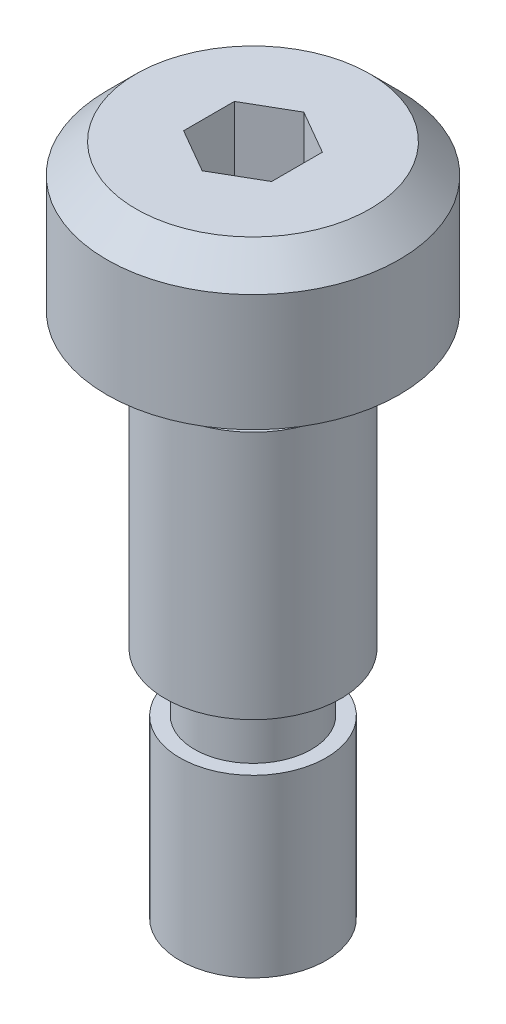
ISO-10303-21;
HEADER;
FILE_DESCRIPTION(('STEP AP214'),'2;1');
FILE_NAME('part.step','',(''),(''),'','','');
FILE_SCHEMA(('AUTOMOTIVE_DESIGN { 1 0 10303 214 1 1 1 1 }'));
ENDSEC;
DATA;
#1=APPLICATION_CONTEXT('core data for automotive mechanical design processes');
#2=APPLICATION_PROTOCOL_DEFINITION('international standard','automotive_design',2000,#1);
#3=PRODUCT_CONTEXT('',#1,'mechanical');
#4=PRODUCT('Part','Part','',(#3));
#5=PRODUCT_RELATED_PRODUCT_CATEGORY('part','',(#4));
#6=PRODUCT_DEFINITION_FORMATION('','',#4);
#7=PRODUCT_DEFINITION_CONTEXT('part definition',#1,'design');
#8=PRODUCT_DEFINITION('design','',#6,#7);
#9=PRODUCT_DEFINITION_SHAPE('','',#8);
#10=(LENGTH_UNIT() NAMED_UNIT(*) SI_UNIT(.MILLI.,.METRE.));
#11=(NAMED_UNIT(*) PLANE_ANGLE_UNIT() SI_UNIT($,.RADIAN.));
#12=(NAMED_UNIT(*) SI_UNIT($,.STERADIAN.) SOLID_ANGLE_UNIT());
#13=UNCERTAINTY_MEASURE_WITH_UNIT(LENGTH_MEASURE(1.E-05),#10,'distance_accuracy_value','');
#14=(GEOMETRIC_REPRESENTATION_CONTEXT(3) GLOBAL_UNCERTAINTY_ASSIGNED_CONTEXT((#13)) GLOBAL_UNIT_ASSIGNED_CONTEXT((#10,
#11,#12)) REPRESENTATION_CONTEXT('',''));
#15=CARTESIAN_POINT('',(0.,0.,0.));
#16=DIRECTION('',(0.,0.,1.));
#17=DIRECTION('',(1.,0.,0.));
#18=AXIS2_PLACEMENT_3D('',#15,#16,#17);
#19=CARTESIAN_POINT('',(0.,0.,0.));
#20=DIRECTION('',(0.,-1.,0.));
#21=DIRECTION('',(0.,0.,-1.));
#22=AXIS2_PLACEMENT_3D('',#19,#20,#21);
#23=PLANE('',#22);
#24=CARTESIAN_POINT('',(0.,0.,0.));
#25=DIRECTION('',(0.,-1.,0.));
#26=DIRECTION('',(0.,0.,-1.));
#27=AXIS2_PLACEMENT_3D('',#24,#25,#26);
#28=CIRCLE('',#27,4.445);
#29=CARTESIAN_POINT('',(0.,0.,-4.445));
#30=VERTEX_POINT('',#29);
#31=EDGE_CURVE('E11',#30,#30,#28,.T.);
#32=ORIENTED_EDGE('',*,*,#31,.F.);
#33=EDGE_LOOP('',(#32));
#34=FACE_BOUND('',#33,.T.);
#35=CARTESIAN_POINT('',(0.,0.,0.));
#36=DIRECTION('',(0.,-1.,0.));
#37=DIRECTION('',(0.,0.,-1.));
#38=AXIS2_PLACEMENT_3D('',#35,#36,#37);
#39=CIRCLE('',#38,7.9375);
#40=CARTESIAN_POINT('',(0.,0.,-7.9375));
#41=VERTEX_POINT('',#40);
#42=EDGE_CURVE('E41',#41,#41,#39,.T.);
#43=ORIENTED_EDGE('',*,*,#42,.T.);
#44=EDGE_LOOP('',(#43));
#45=FACE_BOUND('',#44,.T.);
#46=ADVANCED_FACE('F34',(#34,#45),#23,.T.);
#47=CARTESIAN_POINT('',(0.,0.,0.));
#48=DIRECTION('',(0.,-1.,0.));
#49=DIRECTION('',(0.,0.,-1.));
#50=AXIS2_PLACEMENT_3D('',#47,#48,#49);
#51=CYLINDRICAL_SURFACE('',#50,7.9375);
#52=CARTESIAN_POINT('',(0.,6.35,0.));
#53=DIRECTION('',(0.,-1.,0.));
#54=DIRECTION('',(0.,0.,-1.));
#55=AXIS2_PLACEMENT_3D('',#52,#53,#54);
#56=CIRCLE('',#55,7.9375);
#57=CARTESIAN_POINT('',(0.,6.35,-7.9375));
#58=VERTEX_POINT('',#57);
#59=EDGE_CURVE('E166',#58,#58,#56,.T.);
#60=ORIENTED_EDGE('',*,*,#59,.T.);
#61=EDGE_LOOP('',(#60));
#62=FACE_BOUND('',#61,.T.);
#63=ORIENTED_EDGE('',*,*,#42,.F.);
#64=EDGE_LOOP('',(#63));
#65=FACE_BOUND('',#64,.T.);
#66=ADVANCED_FACE('F172',(#62,#65),#51,.T.);
#67=CARTESIAN_POINT('',(0.,6.35,0.));
#68=DIRECTION('',(0.,-1.,0.));
#69=DIRECTION('',(0.,0.,-1.));
#70=AXIS2_PLACEMENT_3D('',#67,#68,#69);
#71=CONICAL_SURFACE('',#70,7.9375,0.785398163397452);
#72=CARTESIAN_POINT('',(0.,7.93749999999999,0.));
#73=DIRECTION('',(0.,-1.,0.));
#74=DIRECTION('',(0.,0.,-1.));
#75=AXIS2_PLACEMENT_3D('',#72,#73,#74);
#76=CIRCLE('',#75,6.35);
#77=CARTESIAN_POINT('',(0.,7.93749999999999,-6.35));
#78=VERTEX_POINT('',#77);
#79=EDGE_CURVE('E163',#78,#78,#76,.T.);
#80=ORIENTED_EDGE('',*,*,#79,.T.);
#81=EDGE_LOOP('',(#80));
#82=FACE_BOUND('',#81,.T.);
#83=ORIENTED_EDGE('',*,*,#59,.F.);
#84=EDGE_LOOP('',(#83));
#85=FACE_BOUND('',#84,.T.);
#86=ADVANCED_FACE('F174',(#82,#85),#71,.T.);
#87=CARTESIAN_POINT('',(6.35,7.93749999999999,0.));
#88=DIRECTION('',(0.,1.,0.));
#89=DIRECTION('',(0.,0.,1.));
#90=AXIS2_PLACEMENT_3D('',#87,#88,#89);
#91=PLANE('',#90);
#92=DIRECTION('',(-4.53589793478602E-07,0.,0.999999999999897));
#93=VECTOR('',#92,1.);
#94=CARTESIAN_POINT('',(-2.38759668147004,7.93749999999999,-1.37848223407189));
#95=LINE('',#94,#93);
#96=CARTESIAN_POINT('',(-2.38759668147004,7.93749999999999,-1.37848223407189));
#97=VERTEX_POINT('',#96);
#98=CARTESIAN_POINT('',(-2.387597932,7.93749999999999,1.37848006809235));
#99=VERTEX_POINT('',#98);
#100=EDGE_CURVE('E48',#97,#99,#95,.T.);
#101=ORIENTED_EDGE('',*,*,#100,.F.);
#102=DIRECTION('',(-0.866025781775686,0.,0.499999345299384));
#103=VECTOR('',#102,1.);
#104=CARTESIAN_POINT('',(1.87579371350743E-06,7.93749999999999,-2.75696049718073));
#105=LINE('',#104,#103);
#106=CARTESIAN_POINT('',(1.87579371350743E-06,7.93749999999999,-2.75696049718073));
#107=VERTEX_POINT('',#106);
#108=EDGE_CURVE('E118',#107,#97,#105,.T.);
#109=ORIENTED_EDGE('',*,*,#108,.F.);
#110=DIRECTION('',(-0.866025101391085,0.,-0.500000523760287));
#111=VECTOR('',#110,1.);
#112=CARTESIAN_POINT('',(2.38759855726424,7.93749999999999,-1.37847898510215));
#113=LINE('',#112,#111);
#114=CARTESIAN_POINT('',(2.38759855726424,7.93749999999999,-1.37847898510215));
#115=VERTEX_POINT('',#114);
#116=EDGE_CURVE('E112',#115,#107,#113,.T.);
#117=ORIENTED_EDGE('',*,*,#116,.F.);
#118=DIRECTION('',(4.53589793386286E-07,0.,-0.999999999999897));
#119=VECTOR('',#118,1.);
#120=CARTESIAN_POINT('',(2.38759730673527,7.93749999999999,1.37848115108226));
#121=LINE('',#120,#119);
#122=CARTESIAN_POINT('',(2.38759730673527,7.93749999999999,1.37848115108226));
#123=VERTEX_POINT('',#122);
#124=EDGE_CURVE('E110',#123,#115,#121,.T.);
#125=ORIENTED_EDGE('',*,*,#124,.F.);
#126=DIRECTION('',(0.866025554980997,0.,-0.499999738119788));
#127=VECTOR('',#126,1.);
#128=CARTESIAN_POINT('',(-6.25264571169187E-07,7.93749999999999,2.7569604971813));
#129=LINE('',#128,#127);
#130=CARTESIAN_POINT('',(-6.25264571169187E-07,7.93749999999999,2.7569604971813));
#131=VERTEX_POINT('',#130);
#132=EDGE_CURVE('E91',#131,#123,#129,.T.);
#133=ORIENTED_EDGE('',*,*,#132,.F.);
#134=DIRECTION('',(0.86602532818613,0.,0.500000130940089));
#135=VECTOR('',#134,1.);
#136=CARTESIAN_POINT('',(-2.387597932,7.93749999999999,1.37848006809235));
#137=LINE('',#136,#135);
#138=EDGE_CURVE('E102',#99,#131,#137,.T.);
#139=ORIENTED_EDGE('',*,*,#138,.F.);
#140=EDGE_LOOP('',(#101,#109,#117,#125,#133,#139));
#141=FACE_BOUND('',#140,.T.);
#142=ORIENTED_EDGE('',*,*,#79,.F.);
#143=EDGE_LOOP('',(#142));
#144=FACE_BOUND('',#143,.T.);
#145=ADVANCED_FACE('F106',(#141,#144),#91,.T.);
#146=CARTESIAN_POINT('',(0.,-28.575,0.));
#147=DIRECTION('',(0.,-1.,0.));
#148=DIRECTION('',(0.,0.,-1.));
#149=AXIS2_PLACEMENT_3D('',#146,#147,#148);
#150=PLANE('',#149);
#151=CARTESIAN_POINT('',(0.,-28.575,0.));
#152=DIRECTION('',(0.,-1.,0.));
#153=DIRECTION('',(0.,0.,-1.));
#154=AXIS2_PLACEMENT_3D('',#151,#152,#153);
#155=CIRCLE('',#154,3.96875);
#156=CARTESIAN_POINT('',(0.,-28.575,-3.96875));
#157=VERTEX_POINT('',#156);
#158=EDGE_CURVE('E160',#157,#157,#155,.T.);
#159=ORIENTED_EDGE('',*,*,#158,.T.);
#160=EDGE_LOOP('',(#159));
#161=FACE_BOUND('',#160,.T.);
#162=ADVANCED_FACE('F186',(#161),#150,.T.);
#163=CARTESIAN_POINT('',(0.,0.,0.));
#164=DIRECTION('',(0.,-1.,0.));
#165=DIRECTION('',(0.,0.,-1.));
#166=AXIS2_PLACEMENT_3D('',#163,#164,#165);
#167=CYLINDRICAL_SURFACE('',#166,3.96875);
#168=CARTESIAN_POINT('',(0.,-19.05,0.));
#169=DIRECTION('',(0.,-1.,0.));
#170=DIRECTION('',(0.,0.,-1.));
#171=AXIS2_PLACEMENT_3D('',#168,#169,#170);
#172=CIRCLE('',#171,3.96875);
#173=CARTESIAN_POINT('',(0.,-19.05,-3.96875));
#174=VERTEX_POINT('',#173);
#175=EDGE_CURVE('E157',#174,#174,#172,.T.);
#176=ORIENTED_EDGE('',*,*,#175,.T.);
#177=EDGE_LOOP('',(#176));
#178=FACE_BOUND('',#177,.T.);
#179=ORIENTED_EDGE('',*,*,#158,.F.);
#180=EDGE_LOOP('',(#179));
#181=FACE_BOUND('',#180,.T.);
#182=ADVANCED_FACE('F189',(#178,#181),#167,.T.);
#183=CARTESIAN_POINT('',(3.96875,-19.05,0.));
#184=DIRECTION('',(0.,1.,0.));
#185=DIRECTION('',(0.,0.,1.));
#186=AXIS2_PLACEMENT_3D('',#183,#184,#185);
#187=PLANE('',#186);
#188=CARTESIAN_POINT('',(0.,-19.05,0.));
#189=DIRECTION('',(0.,-1.,0.));
#190=DIRECTION('',(0.,0.,-1.));
#191=AXIS2_PLACEMENT_3D('',#188,#189,#190);
#192=CIRCLE('',#191,3.175);
#193=CARTESIAN_POINT('',(0.,-19.05,-3.175));
#194=VERTEX_POINT('',#193);
#195=EDGE_CURVE('E154',#194,#194,#192,.T.);
#196=ORIENTED_EDGE('',*,*,#195,.T.);
#197=EDGE_LOOP('',(#196));
#198=FACE_BOUND('',#197,.T.);
#199=ORIENTED_EDGE('',*,*,#175,.F.);
#200=EDGE_LOOP('',(#199));
#201=FACE_BOUND('',#200,.T.);
#202=ADVANCED_FACE('F193',(#198,#201),#187,.T.);
#203=CARTESIAN_POINT('',(0.,0.,0.));
#204=DIRECTION('',(0.,-1.,0.));
#205=DIRECTION('',(0.,0.,-1.));
#206=AXIS2_PLACEMENT_3D('',#203,#204,#205);
#207=CYLINDRICAL_SURFACE('',#206,3.175);
#208=CARTESIAN_POINT('',(0.,-15.875,0.));
#209=DIRECTION('',(0.,-1.,0.));
#210=DIRECTION('',(0.,0.,-1.));
#211=AXIS2_PLACEMENT_3D('',#208,#209,#210);
#212=CIRCLE('',#211,3.175);
#213=CARTESIAN_POINT('',(0.,-15.875,-3.175));
#214=VERTEX_POINT('',#213);
#215=EDGE_CURVE('E151',#214,#214,#212,.T.);
#216=ORIENTED_EDGE('',*,*,#215,.T.);
#217=EDGE_LOOP('',(#216));
#218=FACE_BOUND('',#217,.T.);
#219=ORIENTED_EDGE('',*,*,#195,.F.);
#220=EDGE_LOOP('',(#219));
#221=FACE_BOUND('',#220,.T.);
#222=ADVANCED_FACE('F197',(#218,#221),#207,.T.);
#223=CARTESIAN_POINT('',(3.175,-15.875,0.));
#224=DIRECTION('',(0.,-1.,0.));
#225=DIRECTION('',(0.,0.,-1.));
#226=AXIS2_PLACEMENT_3D('',#223,#224,#225);
#227=PLANE('',#226);
#228=CARTESIAN_POINT('',(0.,-15.875,0.));
#229=DIRECTION('',(0.,-1.,0.));
#230=DIRECTION('',(0.,0.,-1.));
#231=AXIS2_PLACEMENT_3D('',#228,#229,#230);
#232=CIRCLE('',#231,4.7625);
#233=CARTESIAN_POINT('',(0.,-15.875,-4.7625));
#234=VERTEX_POINT('',#233);
#235=EDGE_CURVE('E148',#234,#234,#232,.T.);
#236=ORIENTED_EDGE('',*,*,#235,.T.);
#237=EDGE_LOOP('',(#236));
#238=FACE_BOUND('',#237,.T.);
#239=ORIENTED_EDGE('',*,*,#215,.F.);
#240=EDGE_LOOP('',(#239));
#241=FACE_BOUND('',#240,.T.);
#242=ADVANCED_FACE('F201',(#238,#241),#227,.T.);
#243=CARTESIAN_POINT('',(0.,0.,0.));
#244=DIRECTION('',(0.,-1.,0.));
#245=DIRECTION('',(0.,0.,-1.));
#246=AXIS2_PLACEMENT_3D('',#243,#244,#245);
#247=CYLINDRICAL_SURFACE('',#246,4.7625);
#248=CARTESIAN_POINT('',(0.,-2.362197954,0.));
#249=DIRECTION('',(0.,-1.,0.));
#250=DIRECTION('',(0.,0.,-1.));
#251=AXIS2_PLACEMENT_3D('',#248,#249,#250);
#252=CIRCLE('',#251,4.7625);
#253=CARTESIAN_POINT('',(0.,-2.362197954,-4.7625));
#254=VERTEX_POINT('',#253);
#255=EDGE_CURVE('E145',#254,#254,#252,.T.);
#256=ORIENTED_EDGE('',*,*,#255,.T.);
#257=EDGE_LOOP('',(#256));
#258=FACE_BOUND('',#257,.T.);
#259=ORIENTED_EDGE('',*,*,#235,.F.);
#260=EDGE_LOOP('',(#259));
#261=FACE_BOUND('',#260,.T.);
#262=ADVANCED_FACE('F205',(#258,#261),#247,.T.);
#263=CARTESIAN_POINT('',(4.7625,-2.362197954,0.));
#264=DIRECTION('',(0.,1.,0.));
#265=DIRECTION('',(0.,0.,1.));
#266=AXIS2_PLACEMENT_3D('',#263,#264,#265);
#267=PLANE('',#266);
#268=CARTESIAN_POINT('',(0.,-2.362197954,0.));
#269=DIRECTION('',(0.,-1.,0.));
#270=DIRECTION('',(0.,0.,-1.));
#271=AXIS2_PLACEMENT_3D('',#268,#269,#270);
#272=CIRCLE('',#271,4.445);
#273=CARTESIAN_POINT('',(0.,-2.362197954,-4.445));
#274=VERTEX_POINT('',#273);
#275=EDGE_CURVE('E136',#274,#274,#272,.T.);
#276=ORIENTED_EDGE('',*,*,#275,.T.);
#277=EDGE_LOOP('',(#276));
#278=FACE_BOUND('',#277,.T.);
#279=ORIENTED_EDGE('',*,*,#255,.F.);
#280=EDGE_LOOP('',(#279));
#281=FACE_BOUND('',#280,.T.);
#282=ADVANCED_FACE('F209',(#278,#281),#267,.T.);
#283=CARTESIAN_POINT('',(0.,0.,0.));
#284=DIRECTION('',(0.,-1.,0.));
#285=DIRECTION('',(0.,0.,-1.));
#286=AXIS2_PLACEMENT_3D('',#283,#284,#285);
#287=CYLINDRICAL_SURFACE('',#286,4.445);
#288=ORIENTED_EDGE('',*,*,#31,.T.);
#289=EDGE_LOOP('',(#288));
#290=FACE_BOUND('',#289,.T.);
#291=ORIENTED_EDGE('',*,*,#275,.F.);
#292=EDGE_LOOP('',(#291));
#293=FACE_BOUND('',#292,.T.);
#294=ADVANCED_FACE('F213',(#290,#293),#287,.T.);
#295=CARTESIAN_POINT('',(-2.38759668147004,4.35610310199999,-1.37848223407189));
#296=DIRECTION('',(-0.999999999999897,0.,-4.53589793478602E-07));
#297=DIRECTION('',(-4.53589793478602E-07,0.,0.999999999999897));
#298=AXIS2_PLACEMENT_3D('',#295,#296,#297);
#299=PLANE('',#298);
#300=ORIENTED_EDGE('',*,*,#100,.T.);
#301=DIRECTION('',(0.,1.,0.));
#302=VECTOR('',#301,1.);
#303=CARTESIAN_POINT('',(-2.387597932,4.35610310199999,1.37848006809235));
#304=LINE('',#303,#302);
#305=CARTESIAN_POINT('',(-2.387597932,4.35610310199999,1.37848006809235));
#306=VERTEX_POINT('',#305);
#307=EDGE_CURVE('E99',#306,#99,#304,.T.);
#308=ORIENTED_EDGE('',*,*,#307,.F.);
#309=DIRECTION('',(-4.53589793478602E-07,0.,0.999999999999897));
#310=VECTOR('',#309,1.);
#311=CARTESIAN_POINT('',(-2.38759668147004,4.35610310199999,-1.37848223407189));
#312=LINE('',#311,#310);
#313=CARTESIAN_POINT('',(-2.38759668147004,4.35610310199999,-1.37848223407189));
#314=VERTEX_POINT('',#313);
#315=EDGE_CURVE('E120',#314,#306,#312,.T.);
#316=ORIENTED_EDGE('',*,*,#315,.F.);
#317=DIRECTION('',(0.,1.,0.));
#318=VECTOR('',#317,1.);
#319=CARTESIAN_POINT('',(-2.38759668147004,4.35610310199999,-1.37848223407189));
#320=LINE('',#319,#318);
#321=EDGE_CURVE('E55',#314,#97,#320,.T.);
#322=ORIENTED_EDGE('',*,*,#321,.T.);
#323=EDGE_LOOP('',(#300,#308,#316,#322));
#324=FACE_BOUND('',#323,.T.);
#325=ADVANCED_FACE('F217',(#324),#299,.F.);
#326=CARTESIAN_POINT('',(1.87579371350743E-06,4.35610310199999,-2.75696049718073));
#327=DIRECTION('',(-0.499999345299384,0.,-0.866025781775686));
#328=DIRECTION('',(-0.866025781775686,0.,0.499999345299384));
#329=AXIS2_PLACEMENT_3D('',#326,#327,#328);
#330=PLANE('',#329);
#331=ORIENTED_EDGE('',*,*,#108,.T.);
#332=ORIENTED_EDGE('',*,*,#321,.F.);
#333=DIRECTION('',(-0.866025781775686,0.,0.499999345299384));
#334=VECTOR('',#333,1.);
#335=CARTESIAN_POINT('',(1.87579371350743E-06,4.35610310199999,-2.75696049718073));
#336=LINE('',#335,#334);
#337=CARTESIAN_POINT('',(1.87579371350743E-06,4.35610310199999,-2.75696049718073));
#338=VERTEX_POINT('',#337);
#339=EDGE_CURVE('E132',#338,#314,#336,.T.);
#340=ORIENTED_EDGE('',*,*,#339,.F.);
#341=DIRECTION('',(0.,1.,0.));
#342=VECTOR('',#341,1.);
#343=CARTESIAN_POINT('',(1.87579371350743E-06,4.35610310199999,-2.75696049718073));
#344=LINE('',#343,#342);
#345=EDGE_CURVE('E137',#338,#107,#344,.T.);
#346=ORIENTED_EDGE('',*,*,#345,.T.);
#347=EDGE_LOOP('',(#331,#332,#340,#346));
#348=FACE_BOUND('',#347,.T.);
#349=ADVANCED_FACE('F221',(#348),#330,.F.);
#350=CARTESIAN_POINT('',(2.38759855726424,4.35610310199999,-1.37847898510215));
#351=DIRECTION('',(0.500000523760287,0.,-0.866025101391085));
#352=DIRECTION('',(-0.866025101391085,0.,-0.500000523760287));
#353=AXIS2_PLACEMENT_3D('',#350,#351,#352);
#354=PLANE('',#353);
#355=ORIENTED_EDGE('',*,*,#116,.T.);
#356=ORIENTED_EDGE('',*,*,#345,.F.);
#357=DIRECTION('',(-0.866025101391085,0.,-0.500000523760287));
#358=VECTOR('',#357,1.);
#359=CARTESIAN_POINT('',(2.38759855726424,4.35610310199999,-1.37847898510215));
#360=LINE('',#359,#358);
#361=CARTESIAN_POINT('',(2.38759855726424,4.35610310199999,-1.37847898510215));
#362=VERTEX_POINT('',#361);
#363=EDGE_CURVE('E129',#362,#338,#360,.T.);
#364=ORIENTED_EDGE('',*,*,#363,.F.);
#365=DIRECTION('',(0.,1.,0.));
#366=VECTOR('',#365,1.);
#367=CARTESIAN_POINT('',(2.38759855726424,4.35610310199999,-1.37847898510215));
#368=LINE('',#367,#366);
#369=EDGE_CURVE('E139',#362,#115,#368,.T.);
#370=ORIENTED_EDGE('',*,*,#369,.T.);
#371=EDGE_LOOP('',(#355,#356,#364,#370));
#372=FACE_BOUND('',#371,.T.);
#373=ADVANCED_FACE('F230',(#372),#354,.F.);
#374=CARTESIAN_POINT('',(2.38759730673527,4.35610310199999,1.37848115108226));
#375=DIRECTION('',(0.999999999999897,0.,4.53589793386286E-07));
#376=DIRECTION('',(4.53589793386287E-07,0.,-0.999999999999897));
#377=AXIS2_PLACEMENT_3D('',#374,#375,#376);
#378=PLANE('',#377);
#379=ORIENTED_EDGE('',*,*,#124,.T.);
#380=ORIENTED_EDGE('',*,*,#369,.F.);
#381=DIRECTION('',(4.53589793386286E-07,0.,-0.999999999999897));
#382=VECTOR('',#381,1.);
#383=CARTESIAN_POINT('',(2.38759730673527,4.35610310199999,1.37848115108226));
#384=LINE('',#383,#382);
#385=CARTESIAN_POINT('',(2.38759730673527,4.35610310199999,1.37848115108226));
#386=VERTEX_POINT('',#385);
#387=EDGE_CURVE('E126',#386,#362,#384,.T.);
#388=ORIENTED_EDGE('',*,*,#387,.F.);
#389=DIRECTION('',(0.,1.,0.));
#390=VECTOR('',#389,1.);
#391=CARTESIAN_POINT('',(2.38759730673527,4.35610310199999,1.37848115108226));
#392=LINE('',#391,#390);
#393=EDGE_CURVE('E98',#386,#123,#392,.T.);
#394=ORIENTED_EDGE('',*,*,#393,.T.);
#395=EDGE_LOOP('',(#379,#380,#388,#394));
#396=FACE_BOUND('',#395,.T.);
#397=ADVANCED_FACE('F227',(#396),#378,.F.);
#398=CARTESIAN_POINT('',(-6.25264571169187E-07,4.35610310199999,2.7569604971813));
#399=DIRECTION('',(0.499999738119788,0.,0.866025554980997));
#400=DIRECTION('',(0.866025554980997,0.,-0.499999738119788));
#401=AXIS2_PLACEMENT_3D('',#398,#399,#400);
#402=PLANE('',#401);
#403=ORIENTED_EDGE('',*,*,#132,.T.);
#404=ORIENTED_EDGE('',*,*,#393,.F.);
#405=DIRECTION('',(0.866025554980997,0.,-0.499999738119788));
#406=VECTOR('',#405,1.);
#407=CARTESIAN_POINT('',(-6.25264571169187E-07,4.35610310199999,2.7569604971813));
#408=LINE('',#407,#406);
#409=CARTESIAN_POINT('',(-6.25264571169187E-07,4.35610310199999,2.7569604971813));
#410=VERTEX_POINT('',#409);
#411=EDGE_CURVE('E94',#410,#386,#408,.T.);
#412=ORIENTED_EDGE('',*,*,#411,.F.);
#413=DIRECTION('',(0.,1.,0.));
#414=VECTOR('',#413,1.);
#415=CARTESIAN_POINT('',(-6.25264571169187E-07,4.35610310199999,2.7569604971813));
#416=LINE('',#415,#414);
#417=EDGE_CURVE('E87',#410,#131,#416,.T.);
#418=ORIENTED_EDGE('',*,*,#417,.T.);
#419=EDGE_LOOP('',(#403,#404,#412,#418));
#420=FACE_BOUND('',#419,.T.);
#421=ADVANCED_FACE('F89',(#420),#402,.F.);
#422=CARTESIAN_POINT('',(-2.387597932,4.35610310199999,1.37848006809235));
#423=DIRECTION('',(-0.500000130940089,0.,0.86602532818613));
#424=DIRECTION('',(0.86602532818613,0.,0.500000130940089));
#425=AXIS2_PLACEMENT_3D('',#422,#423,#424);
#426=PLANE('',#425);
#427=ORIENTED_EDGE('',*,*,#138,.T.);
#428=ORIENTED_EDGE('',*,*,#417,.F.);
#429=DIRECTION('',(0.86602532818613,0.,0.500000130940089));
#430=VECTOR('',#429,1.);
#431=CARTESIAN_POINT('',(-2.387597932,4.35610310199999,1.37848006809235));
#432=LINE('',#431,#430);
#433=EDGE_CURVE('E123',#306,#410,#432,.T.);
#434=ORIENTED_EDGE('',*,*,#433,.F.);
#435=ORIENTED_EDGE('',*,*,#307,.T.);
#436=EDGE_LOOP('',(#427,#428,#434,#435));
#437=FACE_BOUND('',#436,.T.);
#438=ADVANCED_FACE('F103',(#437),#426,.F.);
#439=CARTESIAN_POINT('',(-2.387597932,4.35610310199999,1.37848006809235));
#440=DIRECTION('',(0.,1.,0.));
#441=DIRECTION('',(0.,0.,1.));
#442=AXIS2_PLACEMENT_3D('',#439,#440,#441);
#443=PLANE('',#442);
#444=ORIENTED_EDGE('',*,*,#315,.T.);
#445=ORIENTED_EDGE('',*,*,#433,.T.);
#446=ORIENTED_EDGE('',*,*,#411,.T.);
#447=ORIENTED_EDGE('',*,*,#387,.T.);
#448=ORIENTED_EDGE('',*,*,#363,.T.);
#449=ORIENTED_EDGE('',*,*,#339,.T.);
#450=EDGE_LOOP('',(#444,#445,#446,#447,#448,#449));
#451=FACE_BOUND('',#450,.T.);
#452=ADVANCED_FACE('F224',(#451),#443,.T.);
#453=CLOSED_SHELL('',(#46,#66,#86,#145,#162,#182,#202,#222,#242,#262,#282,#294,#325,#349,#373,
#397,#421,#438,#452));
#454=MANIFOLD_SOLID_BREP('B2',#453);
#455=ADVANCED_BREP_SHAPE_REPRESENTATION('',(#18,#454),#14);
#456=SHAPE_DEFINITION_REPRESENTATION(#9,#455);
ENDSEC;
END-ISO-10303-21;
